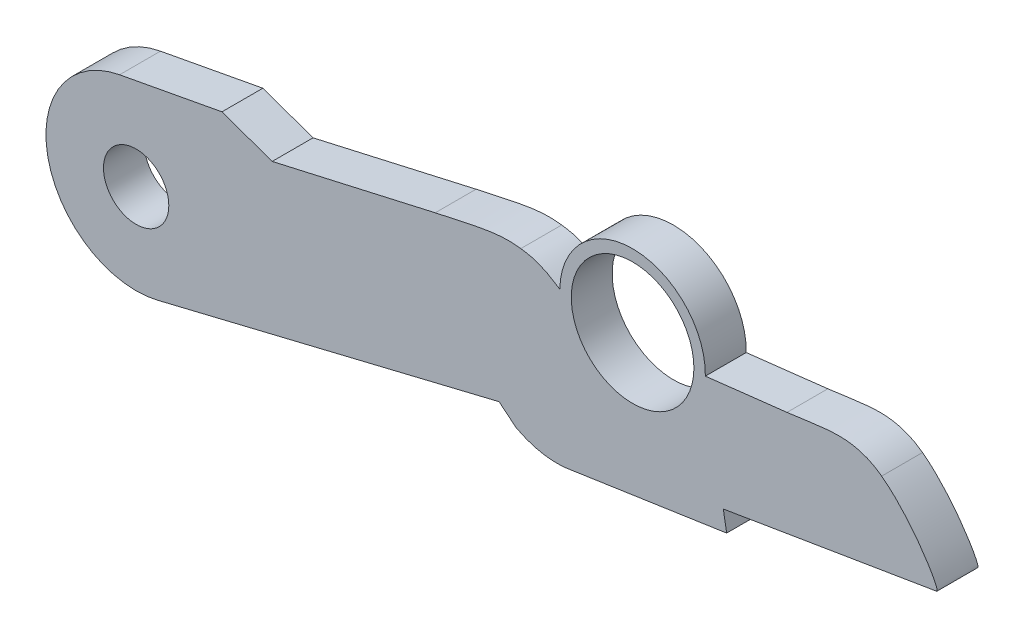
ISO-10303-21;
HEADER;
FILE_DESCRIPTION(('STEP AP214'),'2;1');
FILE_NAME('part.step','',(''),(''),'','','');
FILE_SCHEMA(('AUTOMOTIVE_DESIGN { 1 0 10303 214 1 1 1 1 }'));
ENDSEC;
DATA;
#1=APPLICATION_CONTEXT('core data for automotive mechanical design processes');
#2=APPLICATION_PROTOCOL_DEFINITION('international standard','automotive_design',2000,#1);
#3=PRODUCT_CONTEXT('',#1,'mechanical');
#4=PRODUCT('Part','Part','',(#3));
#5=PRODUCT_RELATED_PRODUCT_CATEGORY('part','',(#4));
#6=PRODUCT_DEFINITION_FORMATION('','',#4);
#7=PRODUCT_DEFINITION_CONTEXT('part definition',#1,'design');
#8=PRODUCT_DEFINITION('design','',#6,#7);
#9=PRODUCT_DEFINITION_SHAPE('','',#8);
#10=(LENGTH_UNIT() NAMED_UNIT(*) SI_UNIT(.MILLI.,.METRE.));
#11=(NAMED_UNIT(*) PLANE_ANGLE_UNIT() SI_UNIT($,.RADIAN.));
#12=(NAMED_UNIT(*) SI_UNIT($,.STERADIAN.) SOLID_ANGLE_UNIT());
#13=UNCERTAINTY_MEASURE_WITH_UNIT(LENGTH_MEASURE(1.E-05),#10,'distance_accuracy_value','');
#14=(GEOMETRIC_REPRESENTATION_CONTEXT(3) GLOBAL_UNCERTAINTY_ASSIGNED_CONTEXT((#13)) GLOBAL_UNIT_ASSIGNED_CONTEXT((#10,
#11,#12)) REPRESENTATION_CONTEXT('',''));
#15=CARTESIAN_POINT('',(0.,0.,0.));
#16=DIRECTION('',(0.,0.,1.));
#17=DIRECTION('',(1.,0.,0.));
#18=AXIS2_PLACEMENT_3D('',#15,#16,#17);
#19=CARTESIAN_POINT('',(-172.508527001182,141.134315657477,3.80000183084875));
#20=DIRECTION('',(0.,0.,1.));
#21=DIRECTION('',(1.,0.,0.));
#22=AXIS2_PLACEMENT_3D('',#19,#20,#21);
#23=PLANE('',#22);
#24=CARTESIAN_POINT('',(-172.508527001182,141.134315657477,3.80000183084875));
#25=DIRECTION('',(0.,0.,1.));
#26=DIRECTION('',(1.,0.,0.));
#27=AXIS2_PLACEMENT_3D('',#24,#25,#26);
#28=CIRCLE('',#27,8.40000000011279);
#29=CARTESIAN_POINT('',(-164.108527001069,141.134315657477,3.80000183084875));
#30=VERTEX_POINT('',#29);
#31=EDGE_CURVE('E205',#30,#30,#28,.T.);
#32=ORIENTED_EDGE('',*,*,#31,.F.);
#33=EDGE_LOOP('',(#32));
#34=FACE_BOUND('',#33,.T.);
#35=CARTESIAN_POINT('',(-172.508527001182,141.134315657477,3.80000183084875));
#36=DIRECTION('',(0.,0.,1.));
#37=DIRECTION('',(1.,0.,0.));
#38=AXIS2_PLACEMENT_3D('',#35,#36,#37);
#39=CIRCLE('',#38,9.96844993154227);
#40=CARTESIAN_POINT('',(-162.541606947403,140.959676946842,3.80000183084875));
#41=VERTEX_POINT('',#40);
#42=CARTESIAN_POINT('',(-182.47544705496,141.308954368111,3.80000183084875));
#43=VERTEX_POINT('',#42);
#44=EDGE_CURVE('E275',#41,#43,#39,.T.);
#45=ORIENTED_EDGE('',*,*,#44,.T.);
#46=CARTESIAN_POINT('',(-182.47544705496,141.308954368111,3.80000183084875));
#47=CARTESIAN_POINT('',(-185.130870863768,143.044636467341,3.80000183084875));
#48=CARTESIAN_POINT('',(-186.201958736827,143.206835258153,3.80000183084875));
#49=CARTESIAN_POINT('',(-187.822986888796,143.447955536166,3.80000183084875));
#50=B_SPLINE_CURVE_WITH_KNOTS('',3,(#46,#47,#48,#49),.UNSPECIFIED.,.F.,.F.,(4,4),
(0.866666666666667,0.9),.UNSPECIFIED.);
#51=CARTESIAN_POINT('',(-187.822986888796,143.447955536166,3.80000183084875));
#52=VERTEX_POINT('',#51);
#53=EDGE_CURVE('E129',#43,#52,#50,.T.);
#54=ORIENTED_EDGE('',*,*,#53,.T.);
#55=CARTESIAN_POINT('',(-187.822986888796,143.447955536166,3.80000183084875));
#56=CARTESIAN_POINT('',(-190.839057531068,143.896752281433,3.80000183084875));
#57=CARTESIAN_POINT('',(-193.90341129086,143.024407760612,3.80000183084875));
#58=CARTESIAN_POINT('',(-199.543676753085,141.836967910165,3.80000183084875));
#59=B_SPLINE_CURVE_WITH_KNOTS('',3,(#55,#56,#57,#58),.UNSPECIFIED.,.F.,.F.,(4,4),
(0.833333333333333,0.866666666666667),.UNSPECIFIED.);
#60=CARTESIAN_POINT('',(-199.543676753085,141.836967910165,3.80000183084875));
#61=VERTEX_POINT('',#60);
#62=EDGE_CURVE('E332',#52,#61,#59,.T.);
#63=ORIENTED_EDGE('',*,*,#62,.T.);
#64=DIRECTION('',(-0.975149538052522,-0.221547688852655,0.));
#65=VECTOR('',#64,1.);
#66=CARTESIAN_POINT('',(-221.880672452639,136.762146480181,3.80000183084875));
#67=LINE('',#66,#65);
#68=CARTESIAN_POINT('',(-221.880672452639,136.762146480181,3.80000183084875));
#69=VERTEX_POINT('',#68);
#70=EDGE_CURVE('E352',#61,#69,#67,.T.);
#71=ORIENTED_EDGE('',*,*,#70,.T.);
#72=DIRECTION('',(-0.942059840650587,0.33544486377554,0.));
#73=VECTOR('',#72,1.);
#74=CARTESIAN_POINT('',(-228.755870045794,139.210239075311,3.80000183084875));
#75=LINE('',#74,#73);
#76=CARTESIAN_POINT('',(-228.755870045794,139.210239075311,3.80000183084875));
#77=VERTEX_POINT('',#76);
#78=EDGE_CURVE('E348',#69,#77,#75,.T.);
#79=ORIENTED_EDGE('',*,*,#78,.T.);
#80=DIRECTION('',(-0.983009594817077,-0.183554178643708,0.));
#81=VECTOR('',#80,1.);
#82=CARTESIAN_POINT('',(-228.755870045794,139.210239075311,3.80000183084875));
#83=LINE('',#82,#81);
#84=CARTESIAN_POINT('',(-242.784897063727,136.590644571835,3.80000183084875));
#85=VERTEX_POINT('',#84);
#86=EDGE_CURVE('E351',#77,#85,#83,.T.);
#87=ORIENTED_EDGE('',*,*,#86,.T.);
#88=CARTESIAN_POINT('',(-240.517142080342,124.445865717801,3.80000183084875));
#89=DIRECTION('',(0.,0.,1.));
#90=DIRECTION('',(1.,0.,0.));
#91=AXIS2_PLACEMENT_3D('',#88,#89,#90);
#92=CIRCLE('',#91,12.3546900437871);
#93=CARTESIAN_POINT('',(-237.603839285277,112.439574329436,3.80000183084875));
#94=VERTEX_POINT('',#93);
#95=EDGE_CURVE('E356',#85,#94,#92,.T.);
#96=ORIENTED_EDGE('',*,*,#95,.T.);
#97=DIRECTION('',(0.971800291695901,0.235805413550586,0.));
#98=VECTOR('',#97,1.);
#99=CARTESIAN_POINT('',(-190.795443246646,123.797538799962,3.80000183084875));
#100=LINE('',#99,#98);
#101=CARTESIAN_POINT('',(-190.795443246646,123.797538799962,3.80000183084875));
#102=VERTEX_POINT('',#101);
#103=EDGE_CURVE('E363',#94,#102,#100,.T.);
#104=ORIENTED_EDGE('',*,*,#103,.T.);
#105=DIRECTION('',(0.772435765585457,-0.63509289717679,0.));
#106=VECTOR('',#105,1.);
#107=CARTESIAN_POINT('',(-188.444392085948,121.864516069034,3.80000183084875));
#108=LINE('',#107,#106);
#109=CARTESIAN_POINT('',(-188.444392085948,121.864516069034,3.80000183084875));
#110=VERTEX_POINT('',#109);
#111=EDGE_CURVE('E366',#102,#110,#108,.T.);
#112=ORIENTED_EDGE('',*,*,#111,.T.);
#113=CARTESIAN_POINT('',(-188.444392085948,121.864516069034,3.80000183084875));
#114=CARTESIAN_POINT('',(-186.342526098494,120.778145924834,3.80000183084875));
#115=CARTESIAN_POINT('',(-184.079273421591,120.254931163573,3.80000183084875));
#116=CARTESIAN_POINT('',(-181.583981236485,120.530676490694,3.80000183084875));
#117=B_SPLINE_CURVE_WITH_KNOTS('',3,(#113,#114,#115,#116),.UNSPECIFIED.,.F.,.F.,(4,4),
(0.266666666666667,0.3),.UNSPECIFIED.);
#118=CARTESIAN_POINT('',(-181.583981236485,120.530676490694,3.80000183084875));
#119=VERTEX_POINT('',#118);
#120=EDGE_CURVE('E369',#110,#119,#117,.T.);
#121=ORIENTED_EDGE('',*,*,#120,.T.);
#122=DIRECTION('',(0.989117136600877,0.147130180732851,0.));
#123=VECTOR('',#122,1.);
#124=CARTESIAN_POINT('',(-159.621733403187,123.797538799962,3.80000183084875));
#125=LINE('',#124,#123);
#126=CARTESIAN_POINT('',(-159.621733403187,123.797538799962,3.80000183084875));
#127=VERTEX_POINT('',#126);
#128=EDGE_CURVE('E375',#119,#127,#125,.T.);
#129=ORIENTED_EDGE('',*,*,#128,.T.);
#130=DIRECTION('',(-0.171781192201019,0.985135128805179,0.));
#131=VECTOR('',#130,1.);
#132=CARTESIAN_POINT('',(-160.080275364834,126.427196847281,3.80000183084875));
#133=LINE('',#132,#131);
#134=CARTESIAN_POINT('',(-160.080275364834,126.427196847281,3.80000183084875));
#135=VERTEX_POINT('',#134);
#136=EDGE_CURVE('E480',#127,#135,#133,.T.);
#137=ORIENTED_EDGE('',*,*,#136,.T.);
#138=DIRECTION('',(0.986491488751305,0.163812522785146,0.));
#139=VECTOR('',#138,1.);
#140=CARTESIAN_POINT('',(-130.858431947469,131.279650158044,3.80000183084875));
#141=LINE('',#140,#139);
#142=CARTESIAN_POINT('',(-130.858431947469,131.279650158044,3.80000183084875));
#143=VERTEX_POINT('',#142);
#144=EDGE_CURVE('E475',#135,#143,#141,.T.);
#145=ORIENTED_EDGE('',*,*,#144,.T.);
#146=CARTESIAN_POINT('',(-130.858431947469,131.279650158044,3.80000183084875));
#147=CARTESIAN_POINT('',(-130.225288192344,131.384780371115,3.80000183084875));
#148=CARTESIAN_POINT('',(-134.086534873407,137.962063153775,3.80000183084875));
#149=CARTESIAN_POINT('',(-138.387792839515,141.173259605841,3.80000183084875));
#150=B_SPLINE_CURVE_WITH_KNOTS('',3,(#146,#147,#148,#149),.UNSPECIFIED.,.F.,.F.,(4,4),
(0.133333333333333,0.166666666666667),.UNSPECIFIED.);
#151=CARTESIAN_POINT('',(-138.387792839515,141.173259605841,3.80000183084875));
#152=VERTEX_POINT('',#151);
#153=EDGE_CURVE('E175',#143,#152,#150,.T.);
#154=ORIENTED_EDGE('',*,*,#153,.T.);
#155=CARTESIAN_POINT('',(-138.387792839515,141.173259605841,3.80000183084875));
#156=CARTESIAN_POINT('',(-142.357787276093,144.137060451165,3.80000183084875));
#157=CARTESIAN_POINT('',(-146.453214459868,142.81377819057,3.80000183084875));
#158=CARTESIAN_POINT('',(-151.360300044278,142.248038848741,3.80000183084875));
#159=B_SPLINE_CURVE_WITH_KNOTS('',3,(#155,#156,#157,#158),.UNSPECIFIED.,.F.,.F.,(4,4),(0.1,
0.133333333333333),.UNSPECIFIED.);
#160=CARTESIAN_POINT('',(-151.360300044278,142.248038848741,3.80000183084875));
#161=VERTEX_POINT('',#160);
#162=EDGE_CURVE('E169',#152,#161,#159,.T.);
#163=ORIENTED_EDGE('',*,*,#162,.T.);
#164=DIRECTION('',(-0.993418877270989,-0.114537916349336,0.));
#165=VECTOR('',#164,1.);
#166=CARTESIAN_POINT('',(-162.535257791277,140.959603119445,3.80000183084875));
#167=LINE('',#166,#165);
#168=CARTESIAN_POINT('',(-162.535257791277,140.959603119445,3.80000183084875));
#169=VERTEX_POINT('',#168);
#170=EDGE_CURVE('E173',#161,#169,#167,.T.);
#171=ORIENTED_EDGE('',*,*,#170,.T.);
#172=DIRECTION('',(-0.999932402744312,0.0116271209672667,0.));
#173=VECTOR('',#172,1.);
#174=CARTESIAN_POINT('',(-162.541606947403,140.959676946842,3.80000183084875));
#175=LINE('',#174,#173);
#176=EDGE_CURVE('E59',#169,#41,#175,.T.);
#177=ORIENTED_EDGE('',*,*,#176,.T.);
#178=EDGE_LOOP('',(#45,#54,#63,#71,#79,#87,#96,#104,#112,#121,#129,#137,#145,#154,#163,#171,#177));
#179=FACE_BOUND('',#178,.T.);
#180=CARTESIAN_POINT('',(-240.517142080342,124.445865717801,3.80000183084875));
#181=DIRECTION('',(0.,0.,1.));
#182=DIRECTION('',(1.,0.,0.));
#183=AXIS2_PLACEMENT_3D('',#180,#181,#182);
#184=CIRCLE('',#183,4.47559301420053);
#185=CARTESIAN_POINT('',(-236.041549066142,124.445865717801,3.80000183084875));
#186=VERTEX_POINT('',#185);
#187=EDGE_CURVE('E432',#186,#186,#184,.T.);
#188=ORIENTED_EDGE('',*,*,#187,.F.);
#189=EDGE_LOOP('',(#188));
#190=FACE_BOUND('',#189,.T.);
#191=ADVANCED_FACE('F41',(#34,#179,#190),#23,.T.);
#192=CARTESIAN_POINT('',(-172.508527001182,141.134315657477,-1.79999816915125));
#193=DIRECTION('',(0.,0.,1.));
#194=DIRECTION('',(1.,0.,0.));
#195=AXIS2_PLACEMENT_3D('',#192,#193,#194);
#196=PLANE('',#195);
#197=CARTESIAN_POINT('',(-172.508527001182,141.134315657477,-1.79999816915125));
#198=DIRECTION('',(0.,0.,1.));
#199=DIRECTION('',(1.,0.,0.));
#200=AXIS2_PLACEMENT_3D('',#197,#198,#199);
#201=CIRCLE('',#200,9.96844993154227);
#202=CARTESIAN_POINT('',(-162.541606947403,140.959676946842,-1.79999816915125));
#203=VERTEX_POINT('',#202);
#204=CARTESIAN_POINT('',(-182.47544705496,141.308954368111,-1.79999816915125));
#205=VERTEX_POINT('',#204);
#206=EDGE_CURVE('E200',#203,#205,#201,.T.);
#207=ORIENTED_EDGE('',*,*,#206,.F.);
#208=DIRECTION('',(-0.999932402744312,0.0116271209672667,0.));
#209=VECTOR('',#208,1.);
#210=CARTESIAN_POINT('',(-162.541606947403,140.959676946842,-1.79999816915125));
#211=LINE('',#210,#209);
#212=CARTESIAN_POINT('',(-162.535257791277,140.959603119445,-1.79999816915125));
#213=VERTEX_POINT('',#212);
#214=EDGE_CURVE('E121',#213,#203,#211,.T.);
#215=ORIENTED_EDGE('',*,*,#214,.F.);
#216=DIRECTION('',(-0.993418877270989,-0.114537916349336,0.));
#217=VECTOR('',#216,1.);
#218=CARTESIAN_POINT('',(-162.535257791277,140.959603119445,-1.79999816915125));
#219=LINE('',#218,#217);
#220=CARTESIAN_POINT('',(-151.360300044278,142.248038848741,-1.79999816915125));
#221=VERTEX_POINT('',#220);
#222=EDGE_CURVE('E115',#221,#213,#219,.T.);
#223=ORIENTED_EDGE('',*,*,#222,.F.);
#224=CARTESIAN_POINT('',(-138.387792839515,141.173259605841,-1.79999816915125));
#225=CARTESIAN_POINT('',(-142.357787276093,144.137060451165,-1.79999816915125));
#226=CARTESIAN_POINT('',(-146.453214459868,142.81377819057,-1.79999816915125));
#227=CARTESIAN_POINT('',(-151.360300044278,142.248038848741,-1.79999816915125));
#228=B_SPLINE_CURVE_WITH_KNOTS('',3,(#224,#225,#226,#227),.UNSPECIFIED.,.F.,.F.,(4,4),(0.1,
0.133333333333333),.UNSPECIFIED.);
#229=CARTESIAN_POINT('',(-138.387792839515,141.173259605841,-1.79999816915125));
#230=VERTEX_POINT('',#229);
#231=EDGE_CURVE('E184',#230,#221,#228,.T.);
#232=ORIENTED_EDGE('',*,*,#231,.F.);
#233=CARTESIAN_POINT('',(-130.858431947469,131.279650158044,-1.79999816915125));
#234=CARTESIAN_POINT('',(-130.225288192344,131.384780371115,-1.79999816915125));
#235=CARTESIAN_POINT('',(-134.086534873407,137.962063153775,-1.79999816915125));
#236=CARTESIAN_POINT('',(-138.387792839515,141.173259605841,-1.79999816915125));
#237=B_SPLINE_CURVE_WITH_KNOTS('',3,(#233,#234,#235,#236),.UNSPECIFIED.,.F.,.F.,(4,4),
(0.133333333333333,0.166666666666667),.UNSPECIFIED.);
#238=CARTESIAN_POINT('',(-130.858431947469,131.279650158044,-1.79999816915125));
#239=VERTEX_POINT('',#238);
#240=EDGE_CURVE('E256',#239,#230,#237,.T.);
#241=ORIENTED_EDGE('',*,*,#240,.F.);
#242=DIRECTION('',(0.986491488751305,0.163812522785146,0.));
#243=VECTOR('',#242,1.);
#244=CARTESIAN_POINT('',(-130.858431947469,131.279650158044,-1.79999816915125));
#245=LINE('',#244,#243);
#246=CARTESIAN_POINT('',(-160.080275364834,126.427196847281,-1.79999816915125));
#247=VERTEX_POINT('',#246);
#248=EDGE_CURVE('E253',#247,#239,#245,.T.);
#249=ORIENTED_EDGE('',*,*,#248,.F.);
#250=DIRECTION('',(-0.171781192201019,0.985135128805179,0.));
#251=VECTOR('',#250,1.);
#252=CARTESIAN_POINT('',(-160.080275364834,126.427196847281,-1.79999816915125));
#253=LINE('',#252,#251);
#254=CARTESIAN_POINT('',(-159.621733403187,123.797538799962,-1.79999816915125));
#255=VERTEX_POINT('',#254);
#256=EDGE_CURVE('E250',#255,#247,#253,.T.);
#257=ORIENTED_EDGE('',*,*,#256,.F.);
#258=DIRECTION('',(0.989117136600877,0.147130180732851,0.));
#259=VECTOR('',#258,1.);
#260=CARTESIAN_POINT('',(-159.621733403187,123.797538799962,-1.79999816915125));
#261=LINE('',#260,#259);
#262=CARTESIAN_POINT('',(-181.583981236485,120.530676490694,-1.79999816915125));
#263=VERTEX_POINT('',#262);
#264=EDGE_CURVE('E244',#263,#255,#261,.T.);
#265=ORIENTED_EDGE('',*,*,#264,.F.);
#266=CARTESIAN_POINT('',(-188.444392085948,121.864516069034,-1.79999816915125));
#267=CARTESIAN_POINT('',(-186.342526098494,120.778145924834,-1.79999816915125));
#268=CARTESIAN_POINT('',(-184.079273421591,120.254931163573,-1.79999816915125));
#269=CARTESIAN_POINT('',(-181.583981236485,120.530676490694,-1.79999816915125));
#270=B_SPLINE_CURVE_WITH_KNOTS('',3,(#266,#267,#268,#269),.UNSPECIFIED.,.F.,.F.,(4,4),
(0.266666666666667,0.3),.UNSPECIFIED.);
#271=CARTESIAN_POINT('',(-188.444392085948,121.864516069034,-1.79999816915125));
#272=VERTEX_POINT('',#271);
#273=EDGE_CURVE('E239',#272,#263,#270,.T.);
#274=ORIENTED_EDGE('',*,*,#273,.F.);
#275=DIRECTION('',(0.772435765585457,-0.63509289717679,0.));
#276=VECTOR('',#275,1.);
#277=CARTESIAN_POINT('',(-188.444392085948,121.864516069034,-1.79999816915125));
#278=LINE('',#277,#276);
#279=CARTESIAN_POINT('',(-190.795443246646,123.797538799962,-1.79999816915125));
#280=VERTEX_POINT('',#279);
#281=EDGE_CURVE('E236',#280,#272,#278,.T.);
#282=ORIENTED_EDGE('',*,*,#281,.F.);
#283=DIRECTION('',(0.971800291695901,0.235805413550586,0.));
#284=VECTOR('',#283,1.);
#285=CARTESIAN_POINT('',(-190.795443246646,123.797538799962,-1.79999816915125));
#286=LINE('',#285,#284);
#287=CARTESIAN_POINT('',(-237.603839285277,112.439574329436,-1.79999816915125));
#288=VERTEX_POINT('',#287);
#289=EDGE_CURVE('E233',#288,#280,#286,.T.);
#290=ORIENTED_EDGE('',*,*,#289,.F.);
#291=CARTESIAN_POINT('',(-240.517142080342,124.445865717801,-1.79999816915125));
#292=DIRECTION('',(0.,0.,1.));
#293=DIRECTION('',(1.,0.,0.));
#294=AXIS2_PLACEMENT_3D('',#291,#292,#293);
#295=CIRCLE('',#294,12.3546900437871);
#296=CARTESIAN_POINT('',(-242.784897063727,136.590644571835,-1.79999816915125));
#297=VERTEX_POINT('',#296);
#298=EDGE_CURVE('E230',#297,#288,#295,.T.);
#299=ORIENTED_EDGE('',*,*,#298,.F.);
#300=DIRECTION('',(-0.983009594817077,-0.183554178643708,0.));
#301=VECTOR('',#300,1.);
#302=CARTESIAN_POINT('',(-228.755870045794,139.210239075311,-1.79999816915125));
#303=LINE('',#302,#301);
#304=CARTESIAN_POINT('',(-228.755870045794,139.210239075311,-1.79999816915125));
#305=VERTEX_POINT('',#304);
#306=EDGE_CURVE('E227',#305,#297,#303,.T.);
#307=ORIENTED_EDGE('',*,*,#306,.F.);
#308=DIRECTION('',(-0.942059840650587,0.33544486377554,0.));
#309=VECTOR('',#308,1.);
#310=CARTESIAN_POINT('',(-228.755870045794,139.210239075311,-1.79999816915125));
#311=LINE('',#310,#309);
#312=CARTESIAN_POINT('',(-221.880672452639,136.762146480181,-1.79999816915125));
#313=VERTEX_POINT('',#312);
#314=EDGE_CURVE('E224',#313,#305,#311,.T.);
#315=ORIENTED_EDGE('',*,*,#314,.F.);
#316=DIRECTION('',(-0.975149538052522,-0.221547688852655,0.));
#317=VECTOR('',#316,1.);
#318=CARTESIAN_POINT('',(-221.880672452639,136.762146480181,-1.79999816915125));
#319=LINE('',#318,#317);
#320=CARTESIAN_POINT('',(-199.543676753085,141.836967910165,-1.79999816915125));
#321=VERTEX_POINT('',#320);
#322=EDGE_CURVE('E218',#321,#313,#319,.T.);
#323=ORIENTED_EDGE('',*,*,#322,.F.);
#324=CARTESIAN_POINT('',(-187.822986888796,143.447955536166,-1.79999816915125));
#325=CARTESIAN_POINT('',(-190.839057531068,143.896752281433,-1.79999816915125));
#326=CARTESIAN_POINT('',(-193.90341129086,143.024407760612,-1.79999816915125));
#327=CARTESIAN_POINT('',(-199.543676753085,141.836967910165,-1.79999816915125));
#328=B_SPLINE_CURVE_WITH_KNOTS('',3,(#324,#325,#326,#327),.UNSPECIFIED.,.F.,.F.,(4,4),
(0.833333333333333,0.866666666666667),.UNSPECIFIED.);
#329=CARTESIAN_POINT('',(-187.822986888796,143.447955536166,-1.79999816915125));
#330=VERTEX_POINT('',#329);
#331=EDGE_CURVE('E210',#330,#321,#328,.T.);
#332=ORIENTED_EDGE('',*,*,#331,.F.);
#333=CARTESIAN_POINT('',(-182.47544705496,141.308954368111,-1.79999816915125));
#334=CARTESIAN_POINT('',(-185.130870863768,143.044636467341,-1.79999816915125));
#335=CARTESIAN_POINT('',(-186.201958736827,143.206835258153,-1.79999816915125));
#336=CARTESIAN_POINT('',(-187.822986888796,143.447955536166,-1.79999816915125));
#337=B_SPLINE_CURVE_WITH_KNOTS('',3,(#333,#334,#335,#336),.UNSPECIFIED.,.F.,.F.,(4,4),
(0.866666666666667,0.9),.UNSPECIFIED.);
#338=EDGE_CURVE('E204',#205,#330,#337,.T.);
#339=ORIENTED_EDGE('',*,*,#338,.F.);
#340=EDGE_LOOP('',(#207,#215,#223,#232,#241,#249,#257,#265,#274,#282,#290,#299,#307,#315,#323,
#332,#339));
#341=FACE_BOUND('',#340,.T.);
#342=CARTESIAN_POINT('',(-172.508527001182,141.134315657477,-1.79999816915125));
#343=DIRECTION('',(0.,0.,1.));
#344=DIRECTION('',(1.,0.,0.));
#345=AXIS2_PLACEMENT_3D('',#342,#343,#344);
#346=CIRCLE('',#345,8.40000000011279);
#347=CARTESIAN_POINT('',(-164.108527001069,141.134315657477,-1.79999816915125));
#348=VERTEX_POINT('',#347);
#349=EDGE_CURVE('E428',#348,#348,#346,.T.);
#350=ORIENTED_EDGE('',*,*,#349,.T.);
#351=EDGE_LOOP('',(#350));
#352=FACE_BOUND('',#351,.T.);
#353=CARTESIAN_POINT('',(-240.517142080342,124.445865717801,-1.79999816915125));
#354=DIRECTION('',(0.,0.,1.));
#355=DIRECTION('',(1.,0.,0.));
#356=AXIS2_PLACEMENT_3D('',#353,#354,#355);
#357=CIRCLE('',#356,4.47559301420053);
#358=CARTESIAN_POINT('',(-236.041549066142,124.445865717801,-1.79999816915125));
#359=VERTEX_POINT('',#358);
#360=EDGE_CURVE('E436',#359,#359,#357,.T.);
#361=ORIENTED_EDGE('',*,*,#360,.T.);
#362=EDGE_LOOP('',(#361));
#363=FACE_BOUND('',#362,.T.);
#364=ADVANCED_FACE('F336',(#341,#352,#363),#196,.F.);
#365=CARTESIAN_POINT('',(-172.508527001182,141.134315657477,3.80000183084875));
#366=DIRECTION('',(0.,0.,-1.));
#367=DIRECTION('',(-1.,0.,0.));
#368=AXIS2_PLACEMENT_3D('',#365,#366,#367);
#369=CYLINDRICAL_SURFACE('',#368,9.96844993154227);
#370=ORIENTED_EDGE('',*,*,#206,.T.);
#371=DIRECTION('',(0.,0.,-1.));
#372=VECTOR('',#371,1.);
#373=CARTESIAN_POINT('',(-182.47544705496,141.308954368111,3.80000183084875));
#374=LINE('',#373,#372);
#375=EDGE_CURVE('E11',#43,#205,#374,.T.);
#376=ORIENTED_EDGE('',*,*,#375,.F.);
#377=ORIENTED_EDGE('',*,*,#44,.F.);
#378=DIRECTION('',(0.,0.,-1.));
#379=VECTOR('',#378,1.);
#380=CARTESIAN_POINT('',(-162.541606947403,140.959676946842,3.80000183084875));
#381=LINE('',#380,#379);
#382=EDGE_CURVE('E193',#41,#203,#381,.T.);
#383=ORIENTED_EDGE('',*,*,#382,.T.);
#384=EDGE_LOOP('',(#370,#376,#377,#383));
#385=FACE_BOUND('',#384,.T.);
#386=ADVANCED_FACE('F43',(#385),#369,.T.);
#387=DIRECTION('',(0.,0.,-1.));
#388=VECTOR('',#387,1.);
#389=SURFACE_OF_LINEAR_EXTRUSION('',#50,#388);
#390=ORIENTED_EDGE('',*,*,#338,.T.);
#391=DIRECTION('',(0.,0.,-1.));
#392=VECTOR('',#391,1.);
#393=CARTESIAN_POINT('',(-187.822986888796,143.447955536166,3.80000183084875));
#394=LINE('',#393,#392);
#395=EDGE_CURVE('E51',#52,#330,#394,.T.);
#396=ORIENTED_EDGE('',*,*,#395,.F.);
#397=ORIENTED_EDGE('',*,*,#53,.F.);
#398=ORIENTED_EDGE('',*,*,#375,.T.);
#399=EDGE_LOOP('',(#390,#396,#397,#398));
#400=FACE_BOUND('',#399,.T.);
#401=ADVANCED_FACE('F409',(#400),#389,.F.);
#402=DIRECTION('',(0.,0.,-1.));
#403=VECTOR('',#402,1.);
#404=SURFACE_OF_LINEAR_EXTRUSION('',#59,#403);
#405=ORIENTED_EDGE('',*,*,#331,.T.);
#406=DIRECTION('',(0.,0.,-1.));
#407=VECTOR('',#406,1.);
#408=CARTESIAN_POINT('',(-199.543676753085,141.836967910165,3.80000183084875));
#409=LINE('',#408,#407);
#410=EDGE_CURVE('E322',#61,#321,#409,.T.);
#411=ORIENTED_EDGE('',*,*,#410,.F.);
#412=ORIENTED_EDGE('',*,*,#62,.F.);
#413=ORIENTED_EDGE('',*,*,#395,.T.);
#414=EDGE_LOOP('',(#405,#411,#412,#413));
#415=FACE_BOUND('',#414,.T.);
#416=ADVANCED_FACE('F330',(#415),#404,.F.);
#417=CARTESIAN_POINT('',(-221.880672452639,136.762146480181,3.80000183084875));
#418=DIRECTION('',(0.221547688852655,-0.975149538052522,0.));
#419=DIRECTION('',(0.975149538052522,0.221547688852655,0.));
#420=AXIS2_PLACEMENT_3D('',#417,#418,#419);
#421=PLANE('',#420);
#422=ORIENTED_EDGE('',*,*,#322,.T.);
#423=DIRECTION('',(0.,0.,-1.));
#424=VECTOR('',#423,1.);
#425=CARTESIAN_POINT('',(-221.880672452639,136.762146480181,3.80000183084875));
#426=LINE('',#425,#424);
#427=EDGE_CURVE('E318',#69,#313,#426,.T.);
#428=ORIENTED_EDGE('',*,*,#427,.F.);
#429=ORIENTED_EDGE('',*,*,#70,.F.);
#430=ORIENTED_EDGE('',*,*,#410,.T.);
#431=EDGE_LOOP('',(#422,#428,#429,#430));
#432=FACE_BOUND('',#431,.T.);
#433=ADVANCED_FACE('F342',(#432),#421,.F.);
#434=CARTESIAN_POINT('',(-228.755870045794,139.210239075311,3.80000183084875));
#435=DIRECTION('',(-0.33544486377554,-0.942059840650587,0.));
#436=DIRECTION('',(0.942059840650587,-0.33544486377554,0.));
#437=AXIS2_PLACEMENT_3D('',#434,#435,#436);
#438=PLANE('',#437);
#439=ORIENTED_EDGE('',*,*,#314,.T.);
#440=DIRECTION('',(0.,0.,-1.));
#441=VECTOR('',#440,1.);
#442=CARTESIAN_POINT('',(-228.755870045794,139.210239075311,3.80000183084875));
#443=LINE('',#442,#441);
#444=EDGE_CURVE('E314',#77,#305,#443,.T.);
#445=ORIENTED_EDGE('',*,*,#444,.F.);
#446=ORIENTED_EDGE('',*,*,#78,.F.);
#447=ORIENTED_EDGE('',*,*,#427,.T.);
#448=EDGE_LOOP('',(#439,#445,#446,#447));
#449=FACE_BOUND('',#448,.T.);
#450=ADVANCED_FACE('F346',(#449),#438,.F.);
#451=CARTESIAN_POINT('',(-228.755870045794,139.210239075311,3.80000183084875));
#452=DIRECTION('',(0.183554178643708,-0.983009594817077,0.));
#453=DIRECTION('',(0.983009594817077,0.183554178643708,0.));
#454=AXIS2_PLACEMENT_3D('',#451,#452,#453);
#455=PLANE('',#454);
#456=ORIENTED_EDGE('',*,*,#306,.T.);
#457=DIRECTION('',(0.,0.,-1.));
#458=VECTOR('',#457,1.);
#459=CARTESIAN_POINT('',(-242.784897063727,136.590644571835,3.80000183084875));
#460=LINE('',#459,#458);
#461=EDGE_CURVE('E310',#85,#297,#460,.T.);
#462=ORIENTED_EDGE('',*,*,#461,.F.);
#463=ORIENTED_EDGE('',*,*,#86,.F.);
#464=ORIENTED_EDGE('',*,*,#444,.T.);
#465=EDGE_LOOP('',(#456,#462,#463,#464));
#466=FACE_BOUND('',#465,.T.);
#467=ADVANCED_FACE('F399',(#466),#455,.F.);
#468=CARTESIAN_POINT('',(-240.517142080342,124.445865717801,3.80000183084875));
#469=DIRECTION('',(0.,0.,-1.));
#470=DIRECTION('',(-1.,0.,0.));
#471=AXIS2_PLACEMENT_3D('',#468,#469,#470);
#472=CYLINDRICAL_SURFACE('',#471,12.3546900437871);
#473=ORIENTED_EDGE('',*,*,#298,.T.);
#474=DIRECTION('',(0.,0.,-1.));
#475=VECTOR('',#474,1.);
#476=CARTESIAN_POINT('',(-237.603839285277,112.439574329436,3.80000183084875));
#477=LINE('',#476,#475);
#478=EDGE_CURVE('E306',#94,#288,#477,.T.);
#479=ORIENTED_EDGE('',*,*,#478,.F.);
#480=ORIENTED_EDGE('',*,*,#95,.F.);
#481=ORIENTED_EDGE('',*,*,#461,.T.);
#482=EDGE_LOOP('',(#473,#479,#480,#481));
#483=FACE_BOUND('',#482,.T.);
#484=ADVANCED_FACE('F395',(#483),#472,.T.);
#485=CARTESIAN_POINT('',(-190.795443246646,123.797538799962,3.80000183084875));
#486=DIRECTION('',(-0.235805413550586,0.971800291695901,0.));
#487=DIRECTION('',(-0.971800291695901,-0.235805413550586,0.));
#488=AXIS2_PLACEMENT_3D('',#485,#486,#487);
#489=PLANE('',#488);
#490=ORIENTED_EDGE('',*,*,#289,.T.);
#491=DIRECTION('',(0.,0.,-1.));
#492=VECTOR('',#491,1.);
#493=CARTESIAN_POINT('',(-190.795443246646,123.797538799962,3.80000183084875));
#494=LINE('',#493,#492);
#495=EDGE_CURVE('E302',#102,#280,#494,.T.);
#496=ORIENTED_EDGE('',*,*,#495,.F.);
#497=ORIENTED_EDGE('',*,*,#103,.F.);
#498=ORIENTED_EDGE('',*,*,#478,.T.);
#499=EDGE_LOOP('',(#490,#496,#497,#498));
#500=FACE_BOUND('',#499,.T.);
#501=ADVANCED_FACE('F391',(#500),#489,.F.);
#502=CARTESIAN_POINT('',(-188.444392085948,121.864516069034,3.80000183084875));
#503=DIRECTION('',(0.63509289717679,0.772435765585457,0.));
#504=DIRECTION('',(-0.772435765585457,0.63509289717679,0.));
#505=AXIS2_PLACEMENT_3D('',#502,#503,#504);
#506=PLANE('',#505);
#507=ORIENTED_EDGE('',*,*,#281,.T.);
#508=DIRECTION('',(0.,0.,-1.));
#509=VECTOR('',#508,1.);
#510=CARTESIAN_POINT('',(-188.444392085948,121.864516069034,3.80000183084875));
#511=LINE('',#510,#509);
#512=EDGE_CURVE('E298',#110,#272,#511,.T.);
#513=ORIENTED_EDGE('',*,*,#512,.F.);
#514=ORIENTED_EDGE('',*,*,#111,.F.);
#515=ORIENTED_EDGE('',*,*,#495,.T.);
#516=EDGE_LOOP('',(#507,#513,#514,#515));
#517=FACE_BOUND('',#516,.T.);
#518=ADVANCED_FACE('F386',(#517),#506,.F.);
#519=DIRECTION('',(0.,0.,-1.));
#520=VECTOR('',#519,1.);
#521=SURFACE_OF_LINEAR_EXTRUSION('',#117,#520);
#522=ORIENTED_EDGE('',*,*,#273,.T.);
#523=DIRECTION('',(0.,0.,-1.));
#524=VECTOR('',#523,1.);
#525=CARTESIAN_POINT('',(-181.583981236485,120.530676490694,3.80000183084875));
#526=LINE('',#525,#524);
#527=EDGE_CURVE('E294',#119,#263,#526,.T.);
#528=ORIENTED_EDGE('',*,*,#527,.F.);
#529=ORIENTED_EDGE('',*,*,#120,.F.);
#530=ORIENTED_EDGE('',*,*,#512,.T.);
#531=EDGE_LOOP('',(#522,#528,#529,#530));
#532=FACE_BOUND('',#531,.T.);
#533=ADVANCED_FACE('F381',(#532),#521,.F.);
#534=CARTESIAN_POINT('',(-159.621733403187,123.797538799962,3.80000183084875));
#535=DIRECTION('',(-0.147130180732851,0.989117136600877,0.));
#536=DIRECTION('',(-0.989117136600877,-0.147130180732851,0.));
#537=AXIS2_PLACEMENT_3D('',#534,#535,#536);
#538=PLANE('',#537);
#539=ORIENTED_EDGE('',*,*,#264,.T.);
#540=DIRECTION('',(0.,0.,-1.));
#541=VECTOR('',#540,1.);
#542=CARTESIAN_POINT('',(-159.621733403187,123.797538799962,3.80000183084875));
#543=LINE('',#542,#541);
#544=EDGE_CURVE('E290',#127,#255,#543,.T.);
#545=ORIENTED_EDGE('',*,*,#544,.F.);
#546=ORIENTED_EDGE('',*,*,#128,.F.);
#547=ORIENTED_EDGE('',*,*,#527,.T.);
#548=EDGE_LOOP('',(#539,#545,#546,#547));
#549=FACE_BOUND('',#548,.T.);
#550=ADVANCED_FACE('F385',(#549),#538,.F.);
#551=CARTESIAN_POINT('',(-160.080275364834,126.427196847281,3.80000183084875));
#552=DIRECTION('',(-0.985135128805179,-0.171781192201019,0.));
#553=DIRECTION('',(0.171781192201019,-0.985135128805179,0.));
#554=AXIS2_PLACEMENT_3D('',#551,#552,#553);
#555=PLANE('',#554);
#556=ORIENTED_EDGE('',*,*,#256,.T.);
#557=DIRECTION('',(0.,0.,-1.));
#558=VECTOR('',#557,1.);
#559=CARTESIAN_POINT('',(-160.080275364834,126.427196847281,3.80000183084875));
#560=LINE('',#559,#558);
#561=EDGE_CURVE('E286',#135,#247,#560,.T.);
#562=ORIENTED_EDGE('',*,*,#561,.F.);
#563=ORIENTED_EDGE('',*,*,#136,.F.);
#564=ORIENTED_EDGE('',*,*,#544,.T.);
#565=EDGE_LOOP('',(#556,#562,#563,#564));
#566=FACE_BOUND('',#565,.T.);
#567=ADVANCED_FACE('F493',(#566),#555,.F.);
#568=CARTESIAN_POINT('',(-130.858431947469,131.279650158044,3.80000183084875));
#569=DIRECTION('',(-0.163812522785146,0.986491488751305,0.));
#570=DIRECTION('',(-0.986491488751305,-0.163812522785146,0.));
#571=AXIS2_PLACEMENT_3D('',#568,#569,#570);
#572=PLANE('',#571);
#573=ORIENTED_EDGE('',*,*,#248,.T.);
#574=DIRECTION('',(0.,0.,-1.));
#575=VECTOR('',#574,1.);
#576=CARTESIAN_POINT('',(-130.858431947469,131.279650158044,3.80000183084875));
#577=LINE('',#576,#575);
#578=EDGE_CURVE('E282',#143,#239,#577,.T.);
#579=ORIENTED_EDGE('',*,*,#578,.F.);
#580=ORIENTED_EDGE('',*,*,#144,.F.);
#581=ORIENTED_EDGE('',*,*,#561,.T.);
#582=EDGE_LOOP('',(#573,#579,#580,#581));
#583=FACE_BOUND('',#582,.T.);
#584=ADVANCED_FACE('F468',(#583),#572,.F.);
#585=DIRECTION('',(0.,0.,-1.));
#586=VECTOR('',#585,1.);
#587=SURFACE_OF_LINEAR_EXTRUSION('',#150,#586);
#588=ORIENTED_EDGE('',*,*,#240,.T.);
#589=DIRECTION('',(0.,0.,-1.));
#590=VECTOR('',#589,1.);
#591=CARTESIAN_POINT('',(-138.387792839515,141.173259605841,3.80000183084875));
#592=LINE('',#591,#590);
#593=EDGE_CURVE('E186',#152,#230,#592,.T.);
#594=ORIENTED_EDGE('',*,*,#593,.F.);
#595=ORIENTED_EDGE('',*,*,#153,.F.);
#596=ORIENTED_EDGE('',*,*,#578,.T.);
#597=EDGE_LOOP('',(#588,#594,#595,#596));
#598=FACE_BOUND('',#597,.T.);
#599=ADVANCED_FACE('F465',(#598),#587,.F.);
#600=DIRECTION('',(0.,0.,-1.));
#601=VECTOR('',#600,1.);
#602=SURFACE_OF_LINEAR_EXTRUSION('',#159,#601);
#603=ORIENTED_EDGE('',*,*,#231,.T.);
#604=DIRECTION('',(0.,0.,-1.));
#605=VECTOR('',#604,1.);
#606=CARTESIAN_POINT('',(-151.360300044278,142.248038848741,3.80000183084875));
#607=LINE('',#606,#605);
#608=EDGE_CURVE('E181',#161,#221,#607,.T.);
#609=ORIENTED_EDGE('',*,*,#608,.F.);
#610=ORIENTED_EDGE('',*,*,#162,.F.);
#611=ORIENTED_EDGE('',*,*,#593,.T.);
#612=EDGE_LOOP('',(#603,#609,#610,#611));
#613=FACE_BOUND('',#612,.T.);
#614=ADVANCED_FACE('F182',(#613),#602,.F.);
#615=CARTESIAN_POINT('',(-162.535257791277,140.959603119445,3.80000183084875));
#616=DIRECTION('',(0.114537916349336,-0.993418877270989,0.));
#617=DIRECTION('',(0.993418877270989,0.114537916349336,0.));
#618=AXIS2_PLACEMENT_3D('',#615,#616,#617);
#619=PLANE('',#618);
#620=ORIENTED_EDGE('',*,*,#222,.T.);
#621=DIRECTION('',(0.,0.,-1.));
#622=VECTOR('',#621,1.);
#623=CARTESIAN_POINT('',(-162.535257791277,140.959603119445,3.80000183084875));
#624=LINE('',#623,#622);
#625=EDGE_CURVE('E187',#169,#213,#624,.T.);
#626=ORIENTED_EDGE('',*,*,#625,.F.);
#627=ORIENTED_EDGE('',*,*,#170,.F.);
#628=ORIENTED_EDGE('',*,*,#608,.T.);
#629=EDGE_LOOP('',(#620,#626,#627,#628));
#630=FACE_BOUND('',#629,.T.);
#631=ADVANCED_FACE('F189',(#630),#619,.F.);
#632=CARTESIAN_POINT('',(-162.541606947403,140.959676946842,3.80000183084875));
#633=DIRECTION('',(-0.0116271209672667,-0.999932402744312,0.));
#634=DIRECTION('',(0.999932402744312,-0.0116271209672667,0.));
#635=AXIS2_PLACEMENT_3D('',#632,#633,#634);
#636=PLANE('',#635);
#637=ORIENTED_EDGE('',*,*,#214,.T.);
#638=ORIENTED_EDGE('',*,*,#382,.F.);
#639=ORIENTED_EDGE('',*,*,#176,.F.);
#640=ORIENTED_EDGE('',*,*,#625,.T.);
#641=EDGE_LOOP('',(#637,#638,#639,#640));
#642=FACE_BOUND('',#641,.T.);
#643=ADVANCED_FACE('F458',(#642),#636,.F.);
#644=CARTESIAN_POINT('',(-172.508527001182,141.134315657477,3.80000183084875));
#645=DIRECTION('',(0.,0.,-1.));
#646=DIRECTION('',(-1.,0.,0.));
#647=AXIS2_PLACEMENT_3D('',#644,#645,#646);
#648=CYLINDRICAL_SURFACE('',#647,8.40000000011279);
#649=ORIENTED_EDGE('',*,*,#31,.T.);
#650=EDGE_LOOP('',(#649));
#651=FACE_BOUND('',#650,.T.);
#652=ORIENTED_EDGE('',*,*,#349,.F.);
#653=EDGE_LOOP('',(#652));
#654=FACE_BOUND('',#653,.T.);
#655=ADVANCED_FACE('F455',(#651,#654),#648,.F.);
#656=CARTESIAN_POINT('',(-240.517142080342,124.445865717801,3.80000183084875));
#657=DIRECTION('',(0.,0.,-1.));
#658=DIRECTION('',(-1.,0.,0.));
#659=AXIS2_PLACEMENT_3D('',#656,#657,#658);
#660=CYLINDRICAL_SURFACE('',#659,4.47559301420053);
#661=ORIENTED_EDGE('',*,*,#187,.T.);
#662=EDGE_LOOP('',(#661));
#663=FACE_BOUND('',#662,.T.);
#664=ORIENTED_EDGE('',*,*,#360,.F.);
#665=EDGE_LOOP('',(#664));
#666=FACE_BOUND('',#665,.T.);
#667=ADVANCED_FACE('F444',(#663,#666),#660,.F.);
#668=CLOSED_SHELL('',(#191,#364,#386,#401,#416,#433,#450,#467,#484,#501,#518,#533,#550,#567,
#584,#599,#614,#631,#643,#655,#667));
#669=MANIFOLD_SOLID_BREP('B2',#668);
#670=ADVANCED_BREP_SHAPE_REPRESENTATION('',(#18,#669),#14);
#671=SHAPE_DEFINITION_REPRESENTATION(#9,#670);
ENDSEC;
END-ISO-10303-21;
